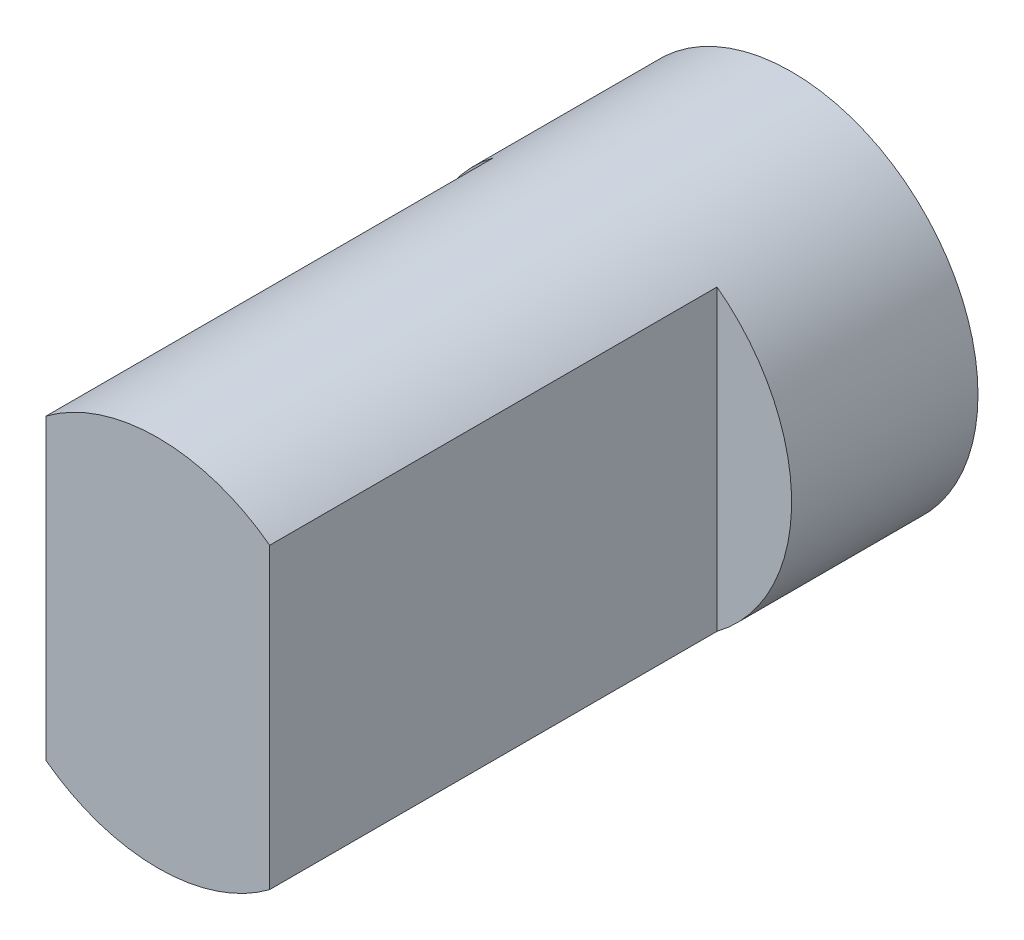
ISO-10303-21;
HEADER;
FILE_DESCRIPTION(('STEP AP214'),'2;1');
FILE_NAME('part.step','',(''),(''),'','','');
FILE_SCHEMA(('AUTOMOTIVE_DESIGN { 1 0 10303 214 1 1 1 1 }'));
ENDSEC;
DATA;
#1=APPLICATION_CONTEXT('core data for automotive mechanical design processes');
#2=APPLICATION_PROTOCOL_DEFINITION('international standard','automotive_design',2000,#1);
#3=PRODUCT_CONTEXT('',#1,'mechanical');
#4=PRODUCT('Part','Part','',(#3));
#5=PRODUCT_RELATED_PRODUCT_CATEGORY('part','',(#4));
#6=PRODUCT_DEFINITION_FORMATION('','',#4);
#7=PRODUCT_DEFINITION_CONTEXT('part definition',#1,'design');
#8=PRODUCT_DEFINITION('design','',#6,#7);
#9=PRODUCT_DEFINITION_SHAPE('','',#8);
#10=(LENGTH_UNIT() NAMED_UNIT(*) SI_UNIT(.MILLI.,.METRE.));
#11=(NAMED_UNIT(*) PLANE_ANGLE_UNIT() SI_UNIT($,.RADIAN.));
#12=(NAMED_UNIT(*) SI_UNIT($,.STERADIAN.) SOLID_ANGLE_UNIT());
#13=UNCERTAINTY_MEASURE_WITH_UNIT(LENGTH_MEASURE(1.E-05),#10,'distance_accuracy_value','');
#14=(GEOMETRIC_REPRESENTATION_CONTEXT(3) GLOBAL_UNCERTAINTY_ASSIGNED_CONTEXT((#13)) GLOBAL_UNIT_ASSIGNED_CONTEXT((#10,
#11,#12)) REPRESENTATION_CONTEXT('',''));
#15=CARTESIAN_POINT('',(0.,0.,0.));
#16=DIRECTION('',(0.,0.,1.));
#17=DIRECTION('',(1.,0.,0.));
#18=AXIS2_PLACEMENT_3D('',#15,#16,#17);
#19=CARTESIAN_POINT('',(0.,0.,8.5));
#20=DIRECTION('',(0.,0.,-1.));
#21=DIRECTION('',(-1.,0.,0.));
#22=AXIS2_PLACEMENT_3D('',#19,#20,#21);
#23=CYLINDRICAL_SURFACE('',#22,2.5);
#24=CARTESIAN_POINT('',(0.,0.,8.5));
#25=DIRECTION('',(0.,0.,1.));
#26=DIRECTION('',(1.,0.,0.));
#27=AXIS2_PLACEMENT_3D('',#24,#25,#26);
#28=CIRCLE('',#27,2.5);
#29=CARTESIAN_POINT('',(-1.5,-2.,8.5));
#30=VERTEX_POINT('',#29);
#31=CARTESIAN_POINT('',(1.5,-2.,8.5));
#32=VERTEX_POINT('',#31);
#33=EDGE_CURVE('E41',#30,#32,#28,.T.);
#34=ORIENTED_EDGE('',*,*,#33,.F.);
#35=DIRECTION('',(0.,0.,1.));
#36=VECTOR('',#35,1.);
#37=CARTESIAN_POINT('',(-1.5,-2.,2.5));
#38=LINE('',#37,#36);
#39=CARTESIAN_POINT('',(-1.5,-2.,2.5));
#40=VERTEX_POINT('',#39);
#41=EDGE_CURVE('E48',#40,#30,#38,.T.);
#42=ORIENTED_EDGE('',*,*,#41,.F.);
#43=CARTESIAN_POINT('',(0.,0.,2.5));
#44=DIRECTION('',(0.,0.,1.));
#45=DIRECTION('',(1.,0.,0.));
#46=AXIS2_PLACEMENT_3D('',#43,#44,#45);
#47=CIRCLE('',#46,2.5);
#48=CARTESIAN_POINT('',(-1.5,2.,2.5));
#49=VERTEX_POINT('',#48);
#50=EDGE_CURVE('E77',#49,#40,#47,.T.);
#51=ORIENTED_EDGE('',*,*,#50,.F.);
#52=DIRECTION('',(0.,0.,1.));
#53=VECTOR('',#52,1.);
#54=CARTESIAN_POINT('',(-1.5,2.,2.5));
#55=LINE('',#54,#53);
#56=CARTESIAN_POINT('',(-1.5,2.,8.5));
#57=VERTEX_POINT('',#56);
#58=EDGE_CURVE('E85',#49,#57,#55,.T.);
#59=ORIENTED_EDGE('',*,*,#58,.T.);
#60=CARTESIAN_POINT('',(1.5,2.,8.5));
#61=VERTEX_POINT('',#60);
#62=EDGE_CURVE('E11',#61,#57,#28,.T.);
#63=ORIENTED_EDGE('',*,*,#62,.F.);
#64=DIRECTION('',(0.,0.,1.));
#65=VECTOR('',#64,1.);
#66=CARTESIAN_POINT('',(1.5,2.,2.5));
#67=LINE('',#66,#65);
#68=CARTESIAN_POINT('',(1.5,2.,2.5));
#69=VERTEX_POINT('',#68);
#70=EDGE_CURVE('E56',#69,#61,#67,.T.);
#71=ORIENTED_EDGE('',*,*,#70,.F.);
#72=CARTESIAN_POINT('',(0.,0.,2.5));
#73=DIRECTION('',(0.,0.,1.));
#74=DIRECTION('',(1.,0.,0.));
#75=AXIS2_PLACEMENT_3D('',#72,#73,#74);
#76=CIRCLE('',#75,2.5);
#77=CARTESIAN_POINT('',(1.5,-2.,2.5));
#78=VERTEX_POINT('',#77);
#79=EDGE_CURVE('E95',#78,#69,#76,.T.);
#80=ORIENTED_EDGE('',*,*,#79,.F.);
#81=DIRECTION('',(0.,0.,1.));
#82=VECTOR('',#81,1.);
#83=CARTESIAN_POINT('',(1.5,-2.,2.5));
#84=LINE('',#83,#82);
#85=EDGE_CURVE('E101',#78,#32,#84,.T.);
#86=ORIENTED_EDGE('',*,*,#85,.T.);
#87=EDGE_LOOP('',(#34,#42,#51,#59,#63,#71,#80,#86));
#88=FACE_BOUND('',#87,.T.);
#89=CARTESIAN_POINT('',(0.,0.,0.));
#90=DIRECTION('',(0.,0.,1.));
#91=DIRECTION('',(1.,0.,0.));
#92=AXIS2_PLACEMENT_3D('',#89,#90,#91);
#93=CIRCLE('',#92,2.5);
#94=CARTESIAN_POINT('',(2.5,0.,0.));
#95=VERTEX_POINT('',#94);
#96=EDGE_CURVE('E36',#95,#95,#93,.T.);
#97=ORIENTED_EDGE('',*,*,#96,.T.);
#98=EDGE_LOOP('',(#97));
#99=FACE_BOUND('',#98,.T.);
#100=ADVANCED_FACE('F33',(#88,#99),#23,.T.);
#101=CARTESIAN_POINT('',(0.,0.,8.5));
#102=DIRECTION('',(0.,0.,1.));
#103=DIRECTION('',(1.,0.,0.));
#104=AXIS2_PLACEMENT_3D('',#101,#102,#103);
#105=PLANE('',#104);
#106=DIRECTION('',(0.,1.,0.));
#107=VECTOR('',#106,1.);
#108=CARTESIAN_POINT('',(-1.5,2.,8.5));
#109=LINE('',#108,#107);
#110=EDGE_CURVE('E82',#30,#57,#109,.T.);
#111=ORIENTED_EDGE('',*,*,#110,.F.);
#112=ORIENTED_EDGE('',*,*,#33,.T.);
#113=DIRECTION('',(0.,-1.,0.));
#114=VECTOR('',#113,1.);
#115=CARTESIAN_POINT('',(1.5,2.,8.5));
#116=LINE('',#115,#114);
#117=EDGE_CURVE('E91',#61,#32,#116,.T.);
#118=ORIENTED_EDGE('',*,*,#117,.F.);
#119=ORIENTED_EDGE('',*,*,#62,.T.);
#120=EDGE_LOOP('',(#111,#112,#118,#119));
#121=FACE_BOUND('',#120,.T.);
#122=ADVANCED_FACE('F107',(#121),#105,.T.);
#123=CARTESIAN_POINT('',(0.,0.,0.));
#124=DIRECTION('',(0.,0.,1.));
#125=DIRECTION('',(1.,0.,0.));
#126=AXIS2_PLACEMENT_3D('',#123,#124,#125);
#127=PLANE('',#126);
#128=ORIENTED_EDGE('',*,*,#96,.F.);
#129=EDGE_LOOP('',(#128));
#130=FACE_BOUND('',#129,.T.);
#131=ADVANCED_FACE('F119',(#130),#127,.F.);
#132=CARTESIAN_POINT('',(1.5,2.,2.5));
#133=DIRECTION('',(-1.,0.,0.));
#134=DIRECTION('',(0.,0.,1.));
#135=AXIS2_PLACEMENT_3D('',#132,#133,#134);
#136=PLANE('',#135);
#137=ORIENTED_EDGE('',*,*,#117,.T.);
#138=ORIENTED_EDGE('',*,*,#85,.F.);
#139=DIRECTION('',(0.,-1.,0.));
#140=VECTOR('',#139,1.);
#141=CARTESIAN_POINT('',(1.5,2.,2.5));
#142=LINE('',#141,#140);
#143=EDGE_CURVE('E97',#69,#78,#142,.T.);
#144=ORIENTED_EDGE('',*,*,#143,.F.);
#145=ORIENTED_EDGE('',*,*,#70,.T.);
#146=EDGE_LOOP('',(#137,#138,#144,#145));
#147=FACE_BOUND('',#146,.T.);
#148=ADVANCED_FACE('F109',(#147),#136,.F.);
#149=CARTESIAN_POINT('',(0.,0.,2.5));
#150=DIRECTION('',(0.,0.,1.));
#151=DIRECTION('',(1.,0.,0.));
#152=AXIS2_PLACEMENT_3D('',#149,#150,#151);
#153=PLANE('',#152);
#154=ORIENTED_EDGE('',*,*,#79,.T.);
#155=ORIENTED_EDGE('',*,*,#143,.T.);
#156=EDGE_LOOP('',(#154,#155));
#157=FACE_BOUND('',#156,.T.);
#158=ADVANCED_FACE('F111',(#157),#153,.T.);
#159=CARTESIAN_POINT('',(-1.5,2.,2.5));
#160=DIRECTION('',(1.,0.,0.));
#161=DIRECTION('',(0.,0.,-1.));
#162=AXIS2_PLACEMENT_3D('',#159,#160,#161);
#163=PLANE('',#162);
#164=ORIENTED_EDGE('',*,*,#110,.T.);
#165=ORIENTED_EDGE('',*,*,#58,.F.);
#166=DIRECTION('',(0.,1.,0.));
#167=VECTOR('',#166,1.);
#168=CARTESIAN_POINT('',(-1.5,2.,2.5));
#169=LINE('',#168,#167);
#170=EDGE_CURVE('E79',#40,#49,#169,.T.);
#171=ORIENTED_EDGE('',*,*,#170,.F.);
#172=ORIENTED_EDGE('',*,*,#41,.T.);
#173=EDGE_LOOP('',(#164,#165,#171,#172));
#174=FACE_BOUND('',#173,.T.);
#175=ADVANCED_FACE('F84',(#174),#163,.F.);
#176=CARTESIAN_POINT('',(0.,0.,2.5));
#177=DIRECTION('',(0.,0.,1.));
#178=DIRECTION('',(1.,0.,0.));
#179=AXIS2_PLACEMENT_3D('',#176,#177,#178);
#180=PLANE('',#179);
#181=ORIENTED_EDGE('',*,*,#50,.T.);
#182=ORIENTED_EDGE('',*,*,#170,.T.);
#183=EDGE_LOOP('',(#181,#182));
#184=FACE_BOUND('',#183,.T.);
#185=ADVANCED_FACE('F78',(#184),#180,.T.);
#186=CLOSED_SHELL('',(#100,#122,#131,#148,#158,#175,#185));
#187=MANIFOLD_SOLID_BREP('B2',#186);
#188=ADVANCED_BREP_SHAPE_REPRESENTATION('',(#18,#187),#14);
#189=SHAPE_DEFINITION_REPRESENTATION(#9,#188);
ENDSEC;
END-ISO-10303-21;
